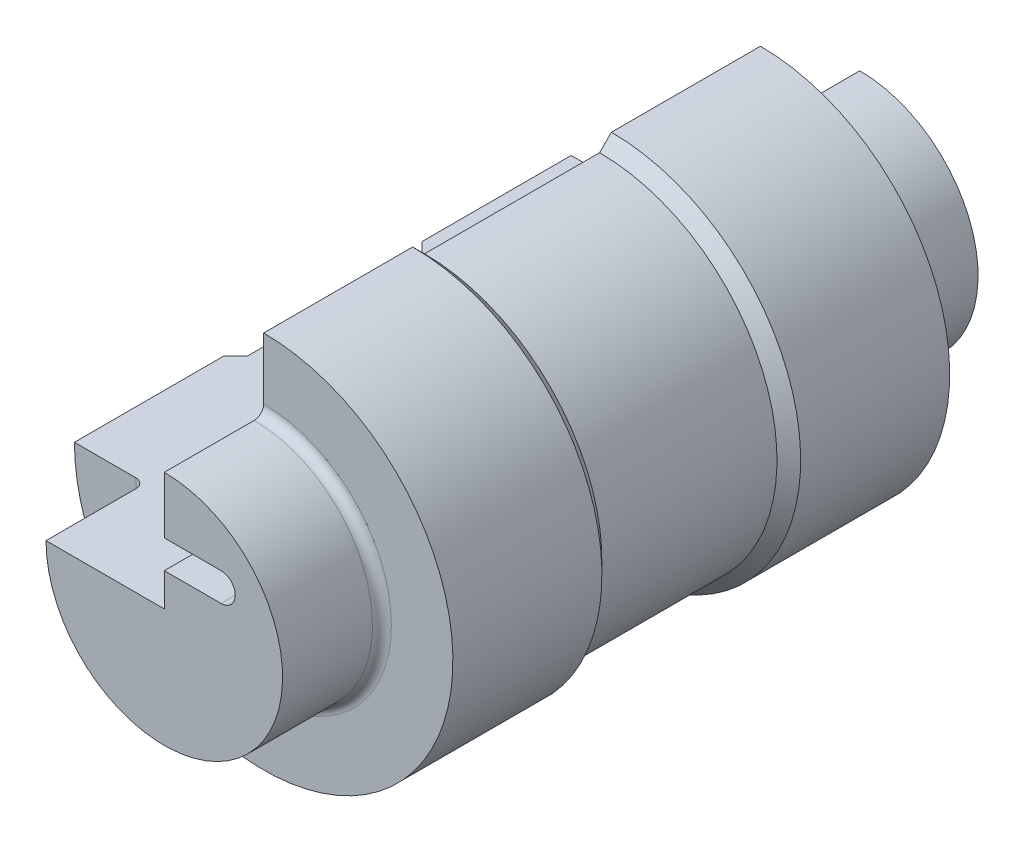
ISO-10303-21;
HEADER;
FILE_DESCRIPTION(('STEP AP214'),'2;1');
FILE_NAME('part.step','',(''),(''),'','','');
FILE_SCHEMA(('AUTOMOTIVE_DESIGN { 1 0 10303 214 1 1 1 1 }'));
ENDSEC;
DATA;
#1=APPLICATION_CONTEXT('core data for automotive mechanical design processes');
#2=APPLICATION_PROTOCOL_DEFINITION('international standard','automotive_design',2000,#1);
#3=PRODUCT_CONTEXT('',#1,'mechanical');
#4=PRODUCT('Part','Part','',(#3));
#5=PRODUCT_RELATED_PRODUCT_CATEGORY('part','',(#4));
#6=PRODUCT_DEFINITION_FORMATION('','',#4);
#7=PRODUCT_DEFINITION_CONTEXT('part definition',#1,'design');
#8=PRODUCT_DEFINITION('design','',#6,#7);
#9=PRODUCT_DEFINITION_SHAPE('','',#8);
#10=(LENGTH_UNIT() NAMED_UNIT(*) SI_UNIT(.MILLI.,.METRE.));
#11=(NAMED_UNIT(*) PLANE_ANGLE_UNIT() SI_UNIT($,.RADIAN.));
#12=(NAMED_UNIT(*) SI_UNIT($,.STERADIAN.) SOLID_ANGLE_UNIT());
#13=UNCERTAINTY_MEASURE_WITH_UNIT(LENGTH_MEASURE(1.E-05),#10,'distance_accuracy_value','');
#14=(GEOMETRIC_REPRESENTATION_CONTEXT(3) GLOBAL_UNCERTAINTY_ASSIGNED_CONTEXT((#13)) GLOBAL_UNIT_ASSIGNED_CONTEXT((#10,
#11,#12)) REPRESENTATION_CONTEXT('',''));
#15=CARTESIAN_POINT('',(0.,0.,0.));
#16=DIRECTION('',(0.,0.,1.));
#17=DIRECTION('',(1.,0.,0.));
#18=AXIS2_PLACEMENT_3D('',#15,#16,#17);
#19=CARTESIAN_POINT('',(0.,0.,-73.5));
#20=DIRECTION('',(1.,0.,0.));
#21=DIRECTION('',(0.,0.,-1.));
#22=AXIS2_PLACEMENT_3D('',#19,#20,#21);
#23=PLANE('',#22);
#24=DIRECTION('',(0.,1.,0.));
#25=VECTOR('',#24,1.);
#26=CARTESIAN_POINT('',(0.,0.,73.5));
#27=LINE('',#26,#25);
#28=CARTESIAN_POINT('',(0.,0.,73.5));
#29=VERTEX_POINT('',#28);
#30=CARTESIAN_POINT('',(0.,7.,73.5));
#31=VERTEX_POINT('',#30);
#32=EDGE_CURVE('E205',#29,#31,#27,.T.);
#33=ORIENTED_EDGE('',*,*,#32,.T.);
#34=DIRECTION('',(0.,0.,1.));
#35=VECTOR('',#34,1.);
#36=CARTESIAN_POINT('',(0.,7.,-73.5));
#37=LINE('',#36,#35);
#38=CARTESIAN_POINT('',(0.,7.,-73.5));
#39=VERTEX_POINT('',#38);
#40=EDGE_CURVE('E176',#39,#31,#37,.T.);
#41=ORIENTED_EDGE('',*,*,#40,.F.);
#42=DIRECTION('',(0.,1.,0.));
#43=VECTOR('',#42,1.);
#44=CARTESIAN_POINT('',(0.,0.,-73.5));
#45=LINE('',#44,#43);
#46=CARTESIAN_POINT('',(0.,0.,-73.5));
#47=VERTEX_POINT('',#46);
#48=EDGE_CURVE('E212',#47,#39,#45,.T.);
#49=ORIENTED_EDGE('',*,*,#48,.F.);
#50=DIRECTION('',(0.,0.,1.));
#51=VECTOR('',#50,1.);
#52=CARTESIAN_POINT('',(0.,0.,-73.5));
#53=LINE('',#52,#51);
#54=EDGE_CURVE('E218',#47,#29,#53,.T.);
#55=ORIENTED_EDGE('',*,*,#54,.T.);
#56=EDGE_LOOP('',(#33,#41,#49,#55));
#57=FACE_BOUND('',#56,.T.);
#58=ADVANCED_FACE('F39',(#57),#23,.F.);
#59=CARTESIAN_POINT('',(0.,0.,-73.5));
#60=DIRECTION('',(0.,0.,1.));
#61=DIRECTION('',(1.,0.,0.));
#62=AXIS2_PLACEMENT_3D('',#59,#60,#61);
#63=PLANE('',#62);
#64=ORIENTED_EDGE('',*,*,#48,.T.);
#65=DIRECTION('',(1.,0.,0.));
#66=VECTOR('',#65,1.);
#67=CARTESIAN_POINT('',(0.,7.,-73.5));
#68=LINE('',#67,#66);
#69=CARTESIAN_POINT('',(12.,7.,-73.5));
#70=VERTEX_POINT('',#69);
#71=EDGE_CURVE('E187',#39,#70,#68,.T.);
#72=ORIENTED_EDGE('',*,*,#71,.T.);
#73=CARTESIAN_POINT('',(12.,10.,-73.5));
#74=DIRECTION('',(0.,0.,1.));
#75=DIRECTION('',(1.,0.,0.));
#76=AXIS2_PLACEMENT_3D('',#73,#74,#75);
#77=CIRCLE('',#76,3.);
#78=CARTESIAN_POINT('',(12.,13.,-73.5));
#79=VERTEX_POINT('',#78);
#80=EDGE_CURVE('E165',#70,#79,#77,.T.);
#81=ORIENTED_EDGE('',*,*,#80,.T.);
#82=DIRECTION('',(-1.,0.,0.));
#83=VECTOR('',#82,1.);
#84=CARTESIAN_POINT('',(0.,13.,-73.5));
#85=LINE('',#84,#83);
#86=CARTESIAN_POINT('',(0.,13.,-73.5));
#87=VERTEX_POINT('',#86);
#88=EDGE_CURVE('E170',#79,#87,#85,.T.);
#89=ORIENTED_EDGE('',*,*,#88,.T.);
#90=CARTESIAN_POINT('',(0.,25.,-73.5));
#91=VERTEX_POINT('',#90);
#92=EDGE_CURVE('E211',#87,#91,#45,.T.);
#93=ORIENTED_EDGE('',*,*,#92,.T.);
#94=CARTESIAN_POINT('',(0.,0.,-73.5));
#95=DIRECTION('',(0.,0.,1.));
#96=DIRECTION('',(1.,0.,0.));
#97=AXIS2_PLACEMENT_3D('',#94,#95,#96);
#98=CIRCLE('',#97,25.);
#99=CARTESIAN_POINT('',(-25.,0.,-73.5));
#100=VERTEX_POINT('',#99);
#101=EDGE_CURVE('E302',#100,#91,#98,.T.);
#102=ORIENTED_EDGE('',*,*,#101,.F.);
#103=DIRECTION('',(1.,0.,0.));
#104=VECTOR('',#103,1.);
#105=CARTESIAN_POINT('',(0.,0.,-73.5));
#106=LINE('',#105,#104);
#107=EDGE_CURVE('E63',#100,#47,#106,.T.);
#108=ORIENTED_EDGE('',*,*,#107,.T.);
#109=EDGE_LOOP('',(#64,#72,#81,#89,#93,#102,#108));
#110=FACE_BOUND('',#109,.T.);
#111=ADVANCED_FACE('F41',(#110),#63,.F.);
#112=CARTESIAN_POINT('',(0.,0.,73.5));
#113=DIRECTION('',(0.,0.,-1.));
#114=DIRECTION('',(-1.,0.,0.));
#115=AXIS2_PLACEMENT_3D('',#112,#113,#114);
#116=PLANE('',#115);
#117=CARTESIAN_POINT('',(12.,10.,73.5));
#118=DIRECTION('',(0.,0.,1.));
#119=DIRECTION('',(1.,0.,0.));
#120=AXIS2_PLACEMENT_3D('',#117,#118,#119);
#121=CIRCLE('',#120,3.);
#122=CARTESIAN_POINT('',(12.,7.,73.5));
#123=VERTEX_POINT('',#122);
#124=CARTESIAN_POINT('',(12.,13.,73.5));
#125=VERTEX_POINT('',#124);
#126=EDGE_CURVE('E163',#123,#125,#121,.T.);
#127=ORIENTED_EDGE('',*,*,#126,.F.);
#128=DIRECTION('',(1.,0.,0.));
#129=VECTOR('',#128,1.);
#130=CARTESIAN_POINT('',(0.,7.,73.5));
#131=LINE('',#130,#129);
#132=EDGE_CURVE('E173',#31,#123,#131,.T.);
#133=ORIENTED_EDGE('',*,*,#132,.F.);
#134=ORIENTED_EDGE('',*,*,#32,.F.);
#135=DIRECTION('',(1.,0.,0.));
#136=VECTOR('',#135,1.);
#137=CARTESIAN_POINT('',(0.,0.,73.5));
#138=LINE('',#137,#136);
#139=CARTESIAN_POINT('',(-25.,0.,73.5));
#140=VERTEX_POINT('',#139);
#141=EDGE_CURVE('E208',#140,#29,#138,.T.);
#142=ORIENTED_EDGE('',*,*,#141,.F.);
#143=CARTESIAN_POINT('',(0.,0.,73.5));
#144=DIRECTION('',(0.,0.,1.));
#145=DIRECTION('',(1.,0.,0.));
#146=AXIS2_PLACEMENT_3D('',#143,#144,#145);
#147=CIRCLE('',#146,25.);
#148=CARTESIAN_POINT('',(0.,25.,73.5));
#149=VERTEX_POINT('',#148);
#150=EDGE_CURVE('E346',#140,#149,#147,.T.);
#151=ORIENTED_EDGE('',*,*,#150,.T.);
#152=CARTESIAN_POINT('',(0.,13.,73.5));
#153=VERTEX_POINT('',#152);
#154=EDGE_CURVE('E199',#153,#149,#27,.T.);
#155=ORIENTED_EDGE('',*,*,#154,.F.);
#156=DIRECTION('',(-1.,0.,0.));
#157=VECTOR('',#156,1.);
#158=CARTESIAN_POINT('',(0.,13.,73.5));
#159=LINE('',#158,#157);
#160=EDGE_CURVE('E55',#125,#153,#159,.T.);
#161=ORIENTED_EDGE('',*,*,#160,.F.);
#162=EDGE_LOOP('',(#127,#133,#134,#142,#151,#155,#161));
#163=FACE_BOUND('',#162,.T.);
#164=ADVANCED_FACE('F182',(#163),#116,.F.);
#165=CARTESIAN_POINT('',(0.,0.,73.5));
#166=DIRECTION('',(0.,0.,1.));
#167=DIRECTION('',(1.,0.,0.));
#168=AXIS2_PLACEMENT_3D('',#165,#166,#167);
#169=CYLINDRICAL_SURFACE('',#168,25.);
#170=CARTESIAN_POINT('',(0.,0.,54.5));
#171=DIRECTION('',(0.,0.,1.));
#172=DIRECTION('',(1.,0.,0.));
#173=AXIS2_PLACEMENT_3D('',#170,#171,#172);
#174=CIRCLE('',#173,25.);
#175=CARTESIAN_POINT('',(-25.,0.,54.5));
#176=VERTEX_POINT('',#175);
#177=CARTESIAN_POINT('',(0.,25.,54.5));
#178=VERTEX_POINT('',#177);
#179=EDGE_CURVE('E342',#176,#178,#174,.T.);
#180=ORIENTED_EDGE('',*,*,#179,.T.);
#181=DIRECTION('',(0.,0.,1.));
#182=VECTOR('',#181,1.);
#183=CARTESIAN_POINT('',(0.,25.,73.5));
#184=LINE('',#183,#182);
#185=EDGE_CURVE('E298',#178,#149,#184,.T.);
#186=ORIENTED_EDGE('',*,*,#185,.T.);
#187=ORIENTED_EDGE('',*,*,#150,.F.);
#188=DIRECTION('',(0.,0.,1.));
#189=VECTOR('',#188,1.);
#190=CARTESIAN_POINT('',(-25.,0.,73.5));
#191=LINE('',#190,#189);
#192=EDGE_CURVE('E258',#140,#176,#191,.F.);
#193=ORIENTED_EDGE('',*,*,#192,.T.);
#194=EDGE_LOOP('',(#180,#186,#187,#193));
#195=FACE_BOUND('',#194,.T.);
#196=ADVANCED_FACE('F392',(#195),#169,.T.);
#197=CARTESIAN_POINT('',(0.,0.,54.5));
#198=DIRECTION('',(0.,0.,1.));
#199=DIRECTION('',(1.,0.,0.));
#200=AXIS2_PLACEMENT_3D('',#197,#198,#199);
#201=TOROIDAL_SURFACE('',#200,27.,2.);
#202=CARTESIAN_POINT('',(0.,0.,52.5));
#203=DIRECTION('',(0.,0.,1.));
#204=DIRECTION('',(1.,0.,0.));
#205=AXIS2_PLACEMENT_3D('',#202,#203,#204);
#206=CIRCLE('',#205,27.);
#207=CARTESIAN_POINT('',(-27.,0.,52.5));
#208=VERTEX_POINT('',#207);
#209=CARTESIAN_POINT('',(0.,27.,52.5));
#210=VERTEX_POINT('',#209);
#211=EDGE_CURVE('E338',#208,#210,#206,.T.);
#212=ORIENTED_EDGE('',*,*,#211,.T.);
#213=CARTESIAN_POINT('',(0.,27.,54.5));
#214=DIRECTION('',(1.,0.,0.));
#215=DIRECTION('',(0.,0.,-1.));
#216=AXIS2_PLACEMENT_3D('',#213,#214,#215);
#217=CIRCLE('',#216,2.);
#218=EDGE_CURVE('E294',#210,#178,#217,.F.);
#219=ORIENTED_EDGE('',*,*,#218,.T.);
#220=ORIENTED_EDGE('',*,*,#179,.F.);
#221=CARTESIAN_POINT('',(-27.,0.,54.5));
#222=DIRECTION('',(0.,-1.,0.));
#223=DIRECTION('',(0.,0.,-1.));
#224=AXIS2_PLACEMENT_3D('',#221,#222,#223);
#225=CIRCLE('',#224,2.);
#226=EDGE_CURVE('E254',#176,#208,#225,.F.);
#227=ORIENTED_EDGE('',*,*,#226,.T.);
#228=EDGE_LOOP('',(#212,#219,#220,#227));
#229=FACE_BOUND('',#228,.T.);
#230=ADVANCED_FACE('F387',(#229),#201,.F.);
#231=CARTESIAN_POINT('',(0.,27.,52.5));
#232=DIRECTION('',(0.,0.,-1.));
#233=DIRECTION('',(-1.,0.,0.));
#234=AXIS2_PLACEMENT_3D('',#231,#232,#233);
#235=PLANE('',#234);
#236=CARTESIAN_POINT('',(0.,0.,52.5));
#237=DIRECTION('',(0.,0.,1.));
#238=DIRECTION('',(1.,0.,0.));
#239=AXIS2_PLACEMENT_3D('',#236,#237,#238);
#240=CIRCLE('',#239,40.);
#241=CARTESIAN_POINT('',(-40.,0.,52.5));
#242=VERTEX_POINT('',#241);
#243=CARTESIAN_POINT('',(0.,40.,52.5));
#244=VERTEX_POINT('',#243);
#245=EDGE_CURVE('E334',#242,#244,#240,.T.);
#246=ORIENTED_EDGE('',*,*,#245,.T.);
#247=DIRECTION('',(0.,-1.,0.));
#248=VECTOR('',#247,1.);
#249=CARTESIAN_POINT('',(0.,27.,52.5));
#250=LINE('',#249,#248);
#251=EDGE_CURVE('E290',#244,#210,#250,.T.);
#252=ORIENTED_EDGE('',*,*,#251,.T.);
#253=ORIENTED_EDGE('',*,*,#211,.F.);
#254=DIRECTION('',(-1.,0.,0.));
#255=VECTOR('',#254,1.);
#256=CARTESIAN_POINT('',(0.,0.,52.5));
#257=LINE('',#256,#255);
#258=EDGE_CURVE('E250',#208,#242,#257,.T.);
#259=ORIENTED_EDGE('',*,*,#258,.T.);
#260=EDGE_LOOP('',(#246,#252,#253,#259));
#261=FACE_BOUND('',#260,.T.);
#262=ADVANCED_FACE('F385',(#261),#235,.F.);
#263=CARTESIAN_POINT('',(0.,0.,73.5));
#264=DIRECTION('',(0.,0.,1.));
#265=DIRECTION('',(1.,0.,0.));
#266=AXIS2_PLACEMENT_3D('',#263,#264,#265);
#267=CYLINDRICAL_SURFACE('',#266,40.);
#268=CARTESIAN_POINT('',(0.,0.,21.));
#269=DIRECTION('',(0.,0.,1.));
#270=DIRECTION('',(1.,0.,0.));
#271=AXIS2_PLACEMENT_3D('',#268,#269,#270);
#272=CIRCLE('',#271,40.);
#273=CARTESIAN_POINT('',(-40.,0.,21.));
#274=VERTEX_POINT('',#273);
#275=CARTESIAN_POINT('',(0.,40.,21.));
#276=VERTEX_POINT('',#275);
#277=EDGE_CURVE('E330',#274,#276,#272,.T.);
#278=ORIENTED_EDGE('',*,*,#277,.T.);
#279=DIRECTION('',(0.,0.,1.));
#280=VECTOR('',#279,1.);
#281=CARTESIAN_POINT('',(0.,40.,73.5));
#282=LINE('',#281,#280);
#283=EDGE_CURVE('E286',#276,#244,#282,.T.);
#284=ORIENTED_EDGE('',*,*,#283,.T.);
#285=ORIENTED_EDGE('',*,*,#245,.F.);
#286=DIRECTION('',(0.,0.,1.));
#287=VECTOR('',#286,1.);
#288=CARTESIAN_POINT('',(-40.,0.,73.5));
#289=LINE('',#288,#287);
#290=EDGE_CURVE('E246',#242,#274,#289,.F.);
#291=ORIENTED_EDGE('',*,*,#290,.T.);
#292=EDGE_LOOP('',(#278,#284,#285,#291));
#293=FACE_BOUND('',#292,.T.);
#294=ADVANCED_FACE('F381',(#293),#267,.T.);
#295=CARTESIAN_POINT('',(0.,0.,18.5));
#296=DIRECTION('',(0.,0.,1.));
#297=DIRECTION('',(1.,0.,0.));
#298=AXIS2_PLACEMENT_3D('',#295,#296,#297);
#299=CONICAL_SURFACE('',#298,37.5,0.785398163397446);
#300=CARTESIAN_POINT('',(0.,0.,18.5));
#301=DIRECTION('',(0.,0.,1.));
#302=DIRECTION('',(1.,0.,0.));
#303=AXIS2_PLACEMENT_3D('',#300,#301,#302);
#304=CIRCLE('',#303,37.5);
#305=CARTESIAN_POINT('',(-37.5,0.,18.5));
#306=VERTEX_POINT('',#305);
#307=CARTESIAN_POINT('',(0.,37.5,18.5));
#308=VERTEX_POINT('',#307);
#309=EDGE_CURVE('E326',#306,#308,#304,.T.);
#310=ORIENTED_EDGE('',*,*,#309,.T.);
#311=DIRECTION('',(0.,0.707106781186546,0.707106781186549));
#312=VECTOR('',#311,1.);
#313=CARTESIAN_POINT('',(0.,0.,-19.0000000000002));
#314=LINE('',#313,#312);
#315=EDGE_CURVE('E282',#308,#276,#314,.T.);
#316=ORIENTED_EDGE('',*,*,#315,.T.);
#317=ORIENTED_EDGE('',*,*,#277,.F.);
#318=DIRECTION('',(0.707106781186546,0.,-0.707106781186549));
#319=VECTOR('',#318,1.);
#320=CARTESIAN_POINT('',(0.,0.,-19.0000000000002));
#321=LINE('',#320,#319);
#322=EDGE_CURVE('E242',#274,#306,#321,.T.);
#323=ORIENTED_EDGE('',*,*,#322,.T.);
#324=EDGE_LOOP('',(#310,#316,#317,#323));
#325=FACE_BOUND('',#324,.T.);
#326=ADVANCED_FACE('F379',(#325),#299,.T.);
#327=CARTESIAN_POINT('',(0.,0.,73.5));
#328=DIRECTION('',(0.,0.,1.));
#329=DIRECTION('',(1.,0.,0.));
#330=AXIS2_PLACEMENT_3D('',#327,#328,#329);
#331=CYLINDRICAL_SURFACE('',#330,37.5);
#332=CARTESIAN_POINT('',(0.,0.,-18.5));
#333=DIRECTION('',(0.,0.,1.));
#334=DIRECTION('',(1.,0.,0.));
#335=AXIS2_PLACEMENT_3D('',#332,#333,#334);
#336=CIRCLE('',#335,37.5);
#337=CARTESIAN_POINT('',(-37.5,0.,-18.5));
#338=VERTEX_POINT('',#337);
#339=CARTESIAN_POINT('',(0.,37.5,-18.5));
#340=VERTEX_POINT('',#339);
#341=EDGE_CURVE('E322',#338,#340,#336,.T.);
#342=ORIENTED_EDGE('',*,*,#341,.T.);
#343=DIRECTION('',(0.,0.,1.));
#344=VECTOR('',#343,1.);
#345=CARTESIAN_POINT('',(0.,37.5,73.5));
#346=LINE('',#345,#344);
#347=EDGE_CURVE('E278',#340,#308,#346,.T.);
#348=ORIENTED_EDGE('',*,*,#347,.T.);
#349=ORIENTED_EDGE('',*,*,#309,.F.);
#350=DIRECTION('',(0.,0.,1.));
#351=VECTOR('',#350,1.);
#352=CARTESIAN_POINT('',(-37.5,0.,73.5));
#353=LINE('',#352,#351);
#354=EDGE_CURVE('E238',#306,#338,#353,.F.);
#355=ORIENTED_EDGE('',*,*,#354,.T.);
#356=EDGE_LOOP('',(#342,#348,#349,#355));
#357=FACE_BOUND('',#356,.T.);
#358=ADVANCED_FACE('F375',(#357),#331,.T.);
#359=CARTESIAN_POINT('',(0.,0.,-21.));
#360=DIRECTION('',(0.,0.,-1.));
#361=DIRECTION('',(-1.,0.,0.));
#362=AXIS2_PLACEMENT_3D('',#359,#360,#361);
#363=CONICAL_SURFACE('',#362,40.,0.785398163397444);
#364=CARTESIAN_POINT('',(0.,0.,-21.));
#365=DIRECTION('',(0.,0.,1.));
#366=DIRECTION('',(1.,0.,0.));
#367=AXIS2_PLACEMENT_3D('',#364,#365,#366);
#368=CIRCLE('',#367,40.);
#369=CARTESIAN_POINT('',(-40.,0.,-21.));
#370=VERTEX_POINT('',#369);
#371=CARTESIAN_POINT('',(0.,40.,-21.));
#372=VERTEX_POINT('',#371);
#373=EDGE_CURVE('E318',#370,#372,#368,.T.);
#374=ORIENTED_EDGE('',*,*,#373,.T.);
#375=DIRECTION('',(0.,-0.707106781186545,0.70710678118655));
#376=VECTOR('',#375,1.);
#377=CARTESIAN_POINT('',(0.,0.,19.0000000000003));
#378=LINE('',#377,#376);
#379=EDGE_CURVE('E274',#372,#340,#378,.T.);
#380=ORIENTED_EDGE('',*,*,#379,.T.);
#381=ORIENTED_EDGE('',*,*,#341,.F.);
#382=DIRECTION('',(-0.707106781186545,0.,-0.70710678118655));
#383=VECTOR('',#382,1.);
#384=CARTESIAN_POINT('',(0.,0.,19.0000000000003));
#385=LINE('',#384,#383);
#386=EDGE_CURVE('E234',#338,#370,#385,.T.);
#387=ORIENTED_EDGE('',*,*,#386,.T.);
#388=EDGE_LOOP('',(#374,#380,#381,#387));
#389=FACE_BOUND('',#388,.T.);
#390=ADVANCED_FACE('F373',(#389),#363,.T.);
#391=CARTESIAN_POINT('',(0.,0.,73.5));
#392=DIRECTION('',(0.,0.,1.));
#393=DIRECTION('',(1.,0.,0.));
#394=AXIS2_PLACEMENT_3D('',#391,#392,#393);
#395=CYLINDRICAL_SURFACE('',#394,40.);
#396=CARTESIAN_POINT('',(0.,0.,-52.5));
#397=DIRECTION('',(0.,0.,1.));
#398=DIRECTION('',(1.,0.,0.));
#399=AXIS2_PLACEMENT_3D('',#396,#397,#398);
#400=CIRCLE('',#399,40.);
#401=CARTESIAN_POINT('',(-40.,0.,-52.5));
#402=VERTEX_POINT('',#401);
#403=CARTESIAN_POINT('',(0.,40.,-52.5));
#404=VERTEX_POINT('',#403);
#405=EDGE_CURVE('E314',#402,#404,#400,.T.);
#406=ORIENTED_EDGE('',*,*,#405,.T.);
#407=DIRECTION('',(0.,0.,1.));
#408=VECTOR('',#407,1.);
#409=CARTESIAN_POINT('',(0.,40.,73.5));
#410=LINE('',#409,#408);
#411=EDGE_CURVE('E270',#404,#372,#410,.T.);
#412=ORIENTED_EDGE('',*,*,#411,.T.);
#413=ORIENTED_EDGE('',*,*,#373,.F.);
#414=DIRECTION('',(0.,0.,1.));
#415=VECTOR('',#414,1.);
#416=CARTESIAN_POINT('',(-40.,0.,73.5));
#417=LINE('',#416,#415);
#418=EDGE_CURVE('E230',#370,#402,#417,.F.);
#419=ORIENTED_EDGE('',*,*,#418,.T.);
#420=EDGE_LOOP('',(#406,#412,#413,#419));
#421=FACE_BOUND('',#420,.T.);
#422=ADVANCED_FACE('F369',(#421),#395,.T.);
#423=CARTESIAN_POINT('',(0.,27.,-52.5));
#424=DIRECTION('',(0.,0.,1.));
#425=DIRECTION('',(1.,0.,0.));
#426=AXIS2_PLACEMENT_3D('',#423,#424,#425);
#427=PLANE('',#426);
#428=CARTESIAN_POINT('',(0.,0.,-52.5));
#429=DIRECTION('',(0.,0.,1.));
#430=DIRECTION('',(1.,0.,0.));
#431=AXIS2_PLACEMENT_3D('',#428,#429,#430);
#432=CIRCLE('',#431,27.);
#433=CARTESIAN_POINT('',(-27.,0.,-52.5));
#434=VERTEX_POINT('',#433);
#435=CARTESIAN_POINT('',(0.,27.,-52.5));
#436=VERTEX_POINT('',#435);
#437=EDGE_CURVE('E310',#434,#436,#432,.T.);
#438=ORIENTED_EDGE('',*,*,#437,.T.);
#439=DIRECTION('',(0.,1.,0.));
#440=VECTOR('',#439,1.);
#441=CARTESIAN_POINT('',(0.,27.,-52.5));
#442=LINE('',#441,#440);
#443=EDGE_CURVE('E266',#436,#404,#442,.T.);
#444=ORIENTED_EDGE('',*,*,#443,.T.);
#445=ORIENTED_EDGE('',*,*,#405,.F.);
#446=DIRECTION('',(1.,0.,0.));
#447=VECTOR('',#446,1.);
#448=CARTESIAN_POINT('',(0.,0.,-52.5));
#449=LINE('',#448,#447);
#450=EDGE_CURVE('E226',#402,#434,#449,.T.);
#451=ORIENTED_EDGE('',*,*,#450,.T.);
#452=EDGE_LOOP('',(#438,#444,#445,#451));
#453=FACE_BOUND('',#452,.T.);
#454=ADVANCED_FACE('F367',(#453),#427,.F.);
#455=CARTESIAN_POINT('',(0.,0.,-54.5));
#456=DIRECTION('',(0.,0.,1.));
#457=DIRECTION('',(1.,0.,0.));
#458=AXIS2_PLACEMENT_3D('',#455,#456,#457);
#459=TOROIDAL_SURFACE('',#458,27.,2.);
#460=CARTESIAN_POINT('',(0.,0.,-54.5));
#461=DIRECTION('',(0.,0.,1.));
#462=DIRECTION('',(1.,0.,0.));
#463=AXIS2_PLACEMENT_3D('',#460,#461,#462);
#464=CIRCLE('',#463,25.);
#465=CARTESIAN_POINT('',(-25.,0.,-54.5));
#466=VERTEX_POINT('',#465);
#467=CARTESIAN_POINT('',(0.,25.,-54.5));
#468=VERTEX_POINT('',#467);
#469=EDGE_CURVE('E306',#466,#468,#464,.T.);
#470=ORIENTED_EDGE('',*,*,#469,.T.);
#471=CARTESIAN_POINT('',(0.,27.,-54.5));
#472=DIRECTION('',(1.,0.,0.));
#473=DIRECTION('',(0.,0.,-1.));
#474=AXIS2_PLACEMENT_3D('',#471,#472,#473);
#475=CIRCLE('',#474,2.);
#476=EDGE_CURVE('E262',#468,#436,#475,.F.);
#477=ORIENTED_EDGE('',*,*,#476,.T.);
#478=ORIENTED_EDGE('',*,*,#437,.F.);
#479=CARTESIAN_POINT('',(-27.,0.,-54.5));
#480=DIRECTION('',(0.,-1.,0.));
#481=DIRECTION('',(0.,0.,-1.));
#482=AXIS2_PLACEMENT_3D('',#479,#480,#481);
#483=CIRCLE('',#482,2.);
#484=EDGE_CURVE('E222',#434,#466,#483,.F.);
#485=ORIENTED_EDGE('',*,*,#484,.T.);
#486=EDGE_LOOP('',(#470,#477,#478,#485));
#487=FACE_BOUND('',#486,.T.);
#488=ADVANCED_FACE('F362',(#487),#459,.F.);
#489=CARTESIAN_POINT('',(0.,0.,73.5));
#490=DIRECTION('',(0.,0.,1.));
#491=DIRECTION('',(1.,0.,0.));
#492=AXIS2_PLACEMENT_3D('',#489,#490,#491);
#493=CYLINDRICAL_SURFACE('',#492,25.);
#494=ORIENTED_EDGE('',*,*,#101,.T.);
#495=DIRECTION('',(0.,0.,1.));
#496=VECTOR('',#495,1.);
#497=CARTESIAN_POINT('',(0.,25.,73.5));
#498=LINE('',#497,#496);
#499=EDGE_CURVE('E11',#91,#468,#498,.T.);
#500=ORIENTED_EDGE('',*,*,#499,.T.);
#501=ORIENTED_EDGE('',*,*,#469,.F.);
#502=DIRECTION('',(0.,0.,1.));
#503=VECTOR('',#502,1.);
#504=CARTESIAN_POINT('',(-25.,0.,73.5));
#505=LINE('',#504,#503);
#506=EDGE_CURVE('E48',#466,#100,#505,.F.);
#507=ORIENTED_EDGE('',*,*,#506,.T.);
#508=EDGE_LOOP('',(#494,#500,#501,#507));
#509=FACE_BOUND('',#508,.T.);
#510=ADVANCED_FACE('F353',(#509),#493,.T.);
#511=ORIENTED_EDGE('',*,*,#92,.F.);
#512=DIRECTION('',(0.,0.,1.));
#513=VECTOR('',#512,1.);
#514=CARTESIAN_POINT('',(0.,13.,-73.5));
#515=LINE('',#514,#513);
#516=EDGE_CURVE('E200',#87,#153,#515,.T.);
#517=ORIENTED_EDGE('',*,*,#516,.T.);
#518=ORIENTED_EDGE('',*,*,#154,.T.);
#519=ORIENTED_EDGE('',*,*,#185,.F.);
#520=ORIENTED_EDGE('',*,*,#218,.F.);
#521=ORIENTED_EDGE('',*,*,#251,.F.);
#522=ORIENTED_EDGE('',*,*,#283,.F.);
#523=ORIENTED_EDGE('',*,*,#315,.F.);
#524=ORIENTED_EDGE('',*,*,#347,.F.);
#525=ORIENTED_EDGE('',*,*,#379,.F.);
#526=ORIENTED_EDGE('',*,*,#411,.F.);
#527=ORIENTED_EDGE('',*,*,#443,.F.);
#528=ORIENTED_EDGE('',*,*,#476,.F.);
#529=ORIENTED_EDGE('',*,*,#499,.F.);
#530=EDGE_LOOP('',(#511,#517,#518,#519,#520,#521,#522,#523,#524,#525,#526,#527,#528,#529));
#531=FACE_BOUND('',#530,.T.);
#532=ADVANCED_FACE('F360',(#531),#23,.F.);
#533=CARTESIAN_POINT('',(0.,0.,-73.5));
#534=DIRECTION('',(0.,-1.,0.));
#535=DIRECTION('',(0.,0.,-1.));
#536=AXIS2_PLACEMENT_3D('',#533,#534,#535);
#537=PLANE('',#536);
#538=ORIENTED_EDGE('',*,*,#141,.T.);
#539=ORIENTED_EDGE('',*,*,#54,.F.);
#540=ORIENTED_EDGE('',*,*,#107,.F.);
#541=ORIENTED_EDGE('',*,*,#506,.F.);
#542=ORIENTED_EDGE('',*,*,#484,.F.);
#543=ORIENTED_EDGE('',*,*,#450,.F.);
#544=ORIENTED_EDGE('',*,*,#418,.F.);
#545=ORIENTED_EDGE('',*,*,#386,.F.);
#546=ORIENTED_EDGE('',*,*,#354,.F.);
#547=ORIENTED_EDGE('',*,*,#322,.F.);
#548=ORIENTED_EDGE('',*,*,#290,.F.);
#549=ORIENTED_EDGE('',*,*,#258,.F.);
#550=ORIENTED_EDGE('',*,*,#226,.F.);
#551=ORIENTED_EDGE('',*,*,#192,.F.);
#552=EDGE_LOOP('',(#538,#539,#540,#541,#542,#543,#544,#545,#546,#547,#548,#549,#550,#551));
#553=FACE_BOUND('',#552,.T.);
#554=ADVANCED_FACE('F364',(#553),#537,.F.);
#555=CARTESIAN_POINT('',(0.,7.,-73.5));
#556=DIRECTION('',(0.,-1.,0.));
#557=DIRECTION('',(0.,0.,-1.));
#558=AXIS2_PLACEMENT_3D('',#555,#556,#557);
#559=PLANE('',#558);
#560=DIRECTION('',(0.,0.,1.));
#561=VECTOR('',#560,1.);
#562=CARTESIAN_POINT('',(12.,7.,-73.5));
#563=LINE('',#562,#561);
#564=EDGE_CURVE('E159',#70,#123,#563,.T.);
#565=ORIENTED_EDGE('',*,*,#564,.F.);
#566=ORIENTED_EDGE('',*,*,#71,.F.);
#567=ORIENTED_EDGE('',*,*,#40,.T.);
#568=ORIENTED_EDGE('',*,*,#132,.T.);
#569=EDGE_LOOP('',(#565,#566,#567,#568));
#570=FACE_BOUND('',#569,.T.);
#571=ADVANCED_FACE('F174',(#570),#559,.F.);
#572=CARTESIAN_POINT('',(0.,13.,-73.5));
#573=DIRECTION('',(0.,1.,0.));
#574=DIRECTION('',(0.,0.,1.));
#575=AXIS2_PLACEMENT_3D('',#572,#573,#574);
#576=PLANE('',#575);
#577=ORIENTED_EDGE('',*,*,#516,.F.);
#578=ORIENTED_EDGE('',*,*,#88,.F.);
#579=DIRECTION('',(0.,0.,1.));
#580=VECTOR('',#579,1.);
#581=CARTESIAN_POINT('',(12.,13.,-73.5));
#582=LINE('',#581,#580);
#583=EDGE_CURVE('E169',#79,#125,#582,.T.);
#584=ORIENTED_EDGE('',*,*,#583,.T.);
#585=ORIENTED_EDGE('',*,*,#160,.T.);
#586=EDGE_LOOP('',(#577,#578,#584,#585));
#587=FACE_BOUND('',#586,.T.);
#588=ADVANCED_FACE('F523',(#587),#576,.F.);
#589=CARTESIAN_POINT('',(12.,10.,-73.5));
#590=DIRECTION('',(0.,0.,1.));
#591=DIRECTION('',(1.,0.,0.));
#592=AXIS2_PLACEMENT_3D('',#589,#590,#591);
#593=CYLINDRICAL_SURFACE('',#592,3.);
#594=ORIENTED_EDGE('',*,*,#583,.F.);
#595=ORIENTED_EDGE('',*,*,#80,.F.);
#596=ORIENTED_EDGE('',*,*,#564,.T.);
#597=ORIENTED_EDGE('',*,*,#126,.T.);
#598=EDGE_LOOP('',(#594,#595,#596,#597));
#599=FACE_BOUND('',#598,.T.);
#600=ADVANCED_FACE('F161',(#599),#593,.F.);
#601=CLOSED_SHELL('',(#58,#111,#164,#196,#230,#262,#294,#326,#358,#390,#422,#454,#488,#510,#532,
#554,#571,#588,#600));
#602=MANIFOLD_SOLID_BREP('B2',#601);
#603=ADVANCED_BREP_SHAPE_REPRESENTATION('',(#18,#602),#14);
#604=SHAPE_DEFINITION_REPRESENTATION(#9,#603);
ENDSEC;
END-ISO-10303-21;
